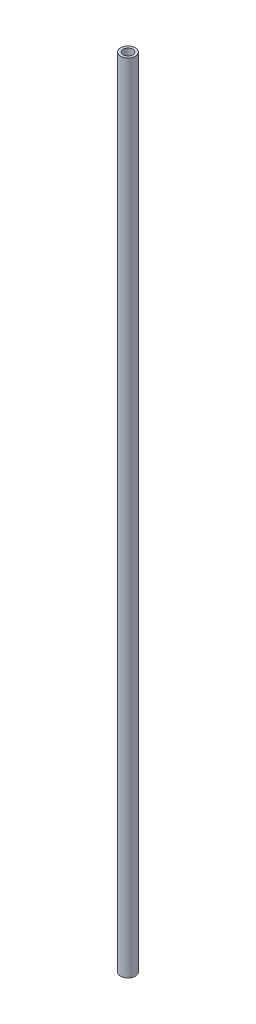
ISO-10303-21;
HEADER;
FILE_DESCRIPTION(('STEP AP214'),'2;1');
FILE_NAME('part.step','',(''),(''),'','','');
FILE_SCHEMA(('AUTOMOTIVE_DESIGN { 1 0 10303 214 1 1 1 1 }'));
ENDSEC;
DATA;
#1=APPLICATION_CONTEXT('core data for automotive mechanical design processes');
#2=APPLICATION_PROTOCOL_DEFINITION('international standard','automotive_design',2000,#1);
#3=PRODUCT_CONTEXT('',#1,'mechanical');
#4=PRODUCT('Part','Part','',(#3));
#5=PRODUCT_RELATED_PRODUCT_CATEGORY('part','',(#4));
#6=PRODUCT_DEFINITION_FORMATION('','',#4);
#7=PRODUCT_DEFINITION_CONTEXT('part definition',#1,'design');
#8=PRODUCT_DEFINITION('design','',#6,#7);
#9=PRODUCT_DEFINITION_SHAPE('','',#8);
#10=(LENGTH_UNIT() NAMED_UNIT(*) SI_UNIT(.MILLI.,.METRE.));
#11=(NAMED_UNIT(*) PLANE_ANGLE_UNIT() SI_UNIT($,.RADIAN.));
#12=(NAMED_UNIT(*) SI_UNIT($,.STERADIAN.) SOLID_ANGLE_UNIT());
#13=UNCERTAINTY_MEASURE_WITH_UNIT(LENGTH_MEASURE(1.E-05),#10,'distance_accuracy_value','');
#14=(GEOMETRIC_REPRESENTATION_CONTEXT(3) GLOBAL_UNCERTAINTY_ASSIGNED_CONTEXT((#13)) GLOBAL_UNIT_ASSIGNED_CONTEXT((#10,
#11,#12)) REPRESENTATION_CONTEXT('',''));
#15=CARTESIAN_POINT('',(0.,0.,0.));
#16=DIRECTION('',(0.,0.,1.));
#17=DIRECTION('',(1.,0.,0.));
#18=AXIS2_PLACEMENT_3D('',#15,#16,#17);
#19=CARTESIAN_POINT('',(0.,313.,0.));
#20=DIRECTION('',(0.,1.,0.));
#21=DIRECTION('',(0.,0.,1.));
#22=AXIS2_PLACEMENT_3D('',#19,#20,#21);
#23=PLANE('',#22);
#24=CARTESIAN_POINT('',(0.,313.,0.));
#25=DIRECTION('',(0.,1.,0.));
#26=DIRECTION('',(0.,0.,1.));
#27=AXIS2_PLACEMENT_3D('',#24,#25,#26);
#28=CIRCLE('',#27,2.9);
#29=CARTESIAN_POINT('',(0.,313.,2.9));
#30=VERTEX_POINT('',#29);
#31=EDGE_CURVE('E10',#30,#30,#28,.T.);
#32=ORIENTED_EDGE('',*,*,#31,.T.);
#33=EDGE_LOOP('',(#32));
#34=FACE_BOUND('',#33,.T.);
#35=CARTESIAN_POINT('',(0.,313.,0.));
#36=DIRECTION('',(0.,1.,0.));
#37=DIRECTION('',(0.,0.,1.));
#38=AXIS2_PLACEMENT_3D('',#35,#36,#37);
#39=CIRCLE('',#38,1.9);
#40=CARTESIAN_POINT('',(0.,313.,1.9));
#41=VERTEX_POINT('',#40);
#42=EDGE_CURVE('E40',#41,#41,#39,.T.);
#43=ORIENTED_EDGE('',*,*,#42,.F.);
#44=EDGE_LOOP('',(#43));
#45=FACE_BOUND('',#44,.T.);
#46=ADVANCED_FACE('F29',(#34,#45),#23,.T.);
#47=CARTESIAN_POINT('',(0.,0.,0.));
#48=DIRECTION('',(0.,1.,0.));
#49=DIRECTION('',(0.,0.,1.));
#50=AXIS2_PLACEMENT_3D('',#47,#48,#49);
#51=PLANE('',#50);
#52=CARTESIAN_POINT('',(0.,0.,0.));
#53=DIRECTION('',(0.,1.,0.));
#54=DIRECTION('',(0.,0.,1.));
#55=AXIS2_PLACEMENT_3D('',#52,#53,#54);
#56=CIRCLE('',#55,2.9);
#57=CARTESIAN_POINT('',(0.,0.,2.9));
#58=VERTEX_POINT('',#57);
#59=EDGE_CURVE('E33',#58,#58,#56,.T.);
#60=ORIENTED_EDGE('',*,*,#59,.F.);
#61=EDGE_LOOP('',(#60));
#62=FACE_BOUND('',#61,.T.);
#63=CARTESIAN_POINT('',(0.,0.,0.));
#64=DIRECTION('',(0.,1.,0.));
#65=DIRECTION('',(0.,0.,1.));
#66=AXIS2_PLACEMENT_3D('',#63,#64,#65);
#67=CIRCLE('',#66,1.9);
#68=CARTESIAN_POINT('',(0.,0.,1.9));
#69=VERTEX_POINT('',#68);
#70=EDGE_CURVE('E42',#69,#69,#67,.T.);
#71=ORIENTED_EDGE('',*,*,#70,.T.);
#72=EDGE_LOOP('',(#71));
#73=FACE_BOUND('',#72,.T.);
#74=ADVANCED_FACE('F52',(#62,#73),#51,.F.);
#75=CARTESIAN_POINT('',(0.,313.,0.));
#76=DIRECTION('',(0.,-1.,0.));
#77=DIRECTION('',(0.,0.,-1.));
#78=AXIS2_PLACEMENT_3D('',#75,#76,#77);
#79=CYLINDRICAL_SURFACE('',#78,2.9);
#80=ORIENTED_EDGE('',*,*,#31,.F.);
#81=EDGE_LOOP('',(#80));
#82=FACE_BOUND('',#81,.T.);
#83=ORIENTED_EDGE('',*,*,#59,.T.);
#84=EDGE_LOOP('',(#83));
#85=FACE_BOUND('',#84,.T.);
#86=ADVANCED_FACE('F31',(#82,#85),#79,.T.);
#87=CARTESIAN_POINT('',(0.,313.,0.));
#88=DIRECTION('',(0.,-1.,0.));
#89=DIRECTION('',(0.,0.,-1.));
#90=AXIS2_PLACEMENT_3D('',#87,#88,#89);
#91=CYLINDRICAL_SURFACE('',#90,1.9);
#92=ORIENTED_EDGE('',*,*,#42,.T.);
#93=EDGE_LOOP('',(#92));
#94=FACE_BOUND('',#93,.T.);
#95=ORIENTED_EDGE('',*,*,#70,.F.);
#96=EDGE_LOOP('',(#95));
#97=FACE_BOUND('',#96,.T.);
#98=ADVANCED_FACE('F48',(#94,#97),#91,.F.);
#99=CLOSED_SHELL('',(#46,#74,#86,#98));
#100=MANIFOLD_SOLID_BREP('B2',#99);
#101=ADVANCED_BREP_SHAPE_REPRESENTATION('',(#18,#100),#14);
#102=SHAPE_DEFINITION_REPRESENTATION(#9,#101);
ENDSEC;
END-ISO-10303-21;
